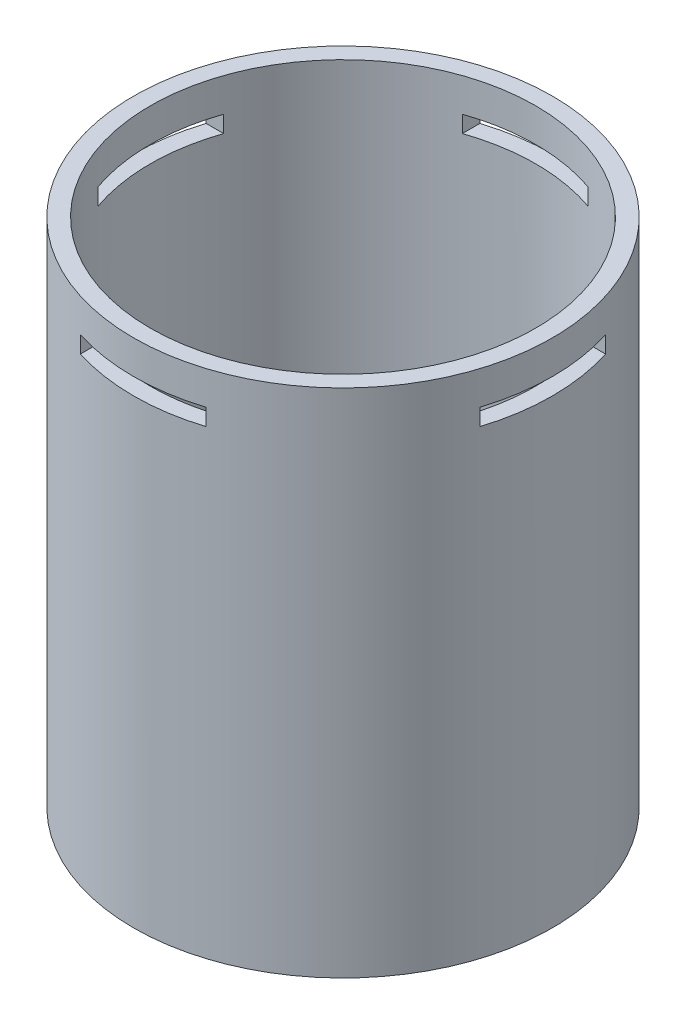
ISO-10303-21;
HEADER;
FILE_DESCRIPTION(('STEP AP214'),'2;1');
FILE_NAME('part.step','',(''),(''),'','','');
FILE_SCHEMA(('AUTOMOTIVE_DESIGN { 1 0 10303 214 1 1 1 1 }'));
ENDSEC;
DATA;
#1=APPLICATION_CONTEXT('core data for automotive mechanical design processes');
#2=APPLICATION_PROTOCOL_DEFINITION('international standard','automotive_design',2000,#1);
#3=PRODUCT_CONTEXT('',#1,'mechanical');
#4=PRODUCT('Part','Part','',(#3));
#5=PRODUCT_RELATED_PRODUCT_CATEGORY('part','',(#4));
#6=PRODUCT_DEFINITION_FORMATION('','',#4);
#7=PRODUCT_DEFINITION_CONTEXT('part definition',#1,'design');
#8=PRODUCT_DEFINITION('design','',#6,#7);
#9=PRODUCT_DEFINITION_SHAPE('','',#8);
#10=(LENGTH_UNIT() NAMED_UNIT(*) SI_UNIT(.MILLI.,.METRE.));
#11=(NAMED_UNIT(*) PLANE_ANGLE_UNIT() SI_UNIT($,.RADIAN.));
#12=(NAMED_UNIT(*) SI_UNIT($,.STERADIAN.) SOLID_ANGLE_UNIT());
#13=UNCERTAINTY_MEASURE_WITH_UNIT(LENGTH_MEASURE(1.E-05),#10,'distance_accuracy_value','');
#14=(GEOMETRIC_REPRESENTATION_CONTEXT(3) GLOBAL_UNCERTAINTY_ASSIGNED_CONTEXT((#13)) GLOBAL_UNIT_ASSIGNED_CONTEXT((#10,
#11,#12)) REPRESENTATION_CONTEXT('',''));
#15=CARTESIAN_POINT('',(0.,0.,0.));
#16=DIRECTION('',(0.,0.,1.));
#17=DIRECTION('',(1.,0.,0.));
#18=AXIS2_PLACEMENT_3D('',#15,#16,#17);
#19=CARTESIAN_POINT('',(0.,61.,0.));
#20=DIRECTION('',(0.,1.,0.));
#21=DIRECTION('',(0.,0.,1.));
#22=AXIS2_PLACEMENT_3D('',#19,#20,#21);
#23=PLANE('',#22);
#24=CARTESIAN_POINT('',(0.,61.,0.));
#25=DIRECTION('',(0.,1.,0.));
#26=DIRECTION('',(0.,0.,1.));
#27=AXIS2_PLACEMENT_3D('',#24,#25,#26);
#28=CIRCLE('',#27,25.);
#29=CARTESIAN_POINT('',(0.,61.,25.));
#30=VERTEX_POINT('',#29);
#31=EDGE_CURVE('E284',#30,#30,#28,.T.);
#32=ORIENTED_EDGE('',*,*,#31,.T.);
#33=EDGE_LOOP('',(#32));
#34=FACE_BOUND('',#33,.T.);
#35=CARTESIAN_POINT('',(0.,61.,0.));
#36=DIRECTION('',(0.,1.,0.));
#37=DIRECTION('',(0.,0.,1.));
#38=AXIS2_PLACEMENT_3D('',#35,#36,#37);
#39=CIRCLE('',#38,23.);
#40=CARTESIAN_POINT('',(0.,61.,23.));
#41=VERTEX_POINT('',#40);
#42=EDGE_CURVE('E278',#41,#41,#39,.T.);
#43=ORIENTED_EDGE('',*,*,#42,.F.);
#44=EDGE_LOOP('',(#43));
#45=FACE_BOUND('',#44,.T.);
#46=ADVANCED_FACE('F36',(#34,#45),#23,.T.);
#47=CARTESIAN_POINT('',(0.,0.,0.));
#48=DIRECTION('',(0.,1.,0.));
#49=DIRECTION('',(0.,0.,1.));
#50=AXIS2_PLACEMENT_3D('',#47,#48,#49);
#51=PLANE('',#50);
#52=CARTESIAN_POINT('',(0.,0.,0.));
#53=DIRECTION('',(0.,1.,0.));
#54=DIRECTION('',(0.,0.,1.));
#55=AXIS2_PLACEMENT_3D('',#52,#53,#54);
#56=CIRCLE('',#55,25.);
#57=CARTESIAN_POINT('',(0.,0.,25.));
#58=VERTEX_POINT('',#57);
#59=EDGE_CURVE('E281',#58,#58,#56,.T.);
#60=ORIENTED_EDGE('',*,*,#59,.F.);
#61=EDGE_LOOP('',(#60));
#62=FACE_BOUND('',#61,.T.);
#63=CARTESIAN_POINT('',(0.,0.,0.));
#64=DIRECTION('',(0.,1.,0.));
#65=DIRECTION('',(0.,0.,1.));
#66=AXIS2_PLACEMENT_3D('',#63,#64,#65);
#67=CIRCLE('',#66,23.);
#68=CARTESIAN_POINT('',(0.,0.,23.));
#69=VERTEX_POINT('',#68);
#70=EDGE_CURVE('E277',#69,#69,#67,.T.);
#71=ORIENTED_EDGE('',*,*,#70,.T.);
#72=EDGE_LOOP('',(#71));
#73=FACE_BOUND('',#72,.T.);
#74=ADVANCED_FACE('F325',(#62,#73),#51,.F.);
#75=CARTESIAN_POINT('',(0.,61.,0.));
#76=DIRECTION('',(0.,-1.,0.));
#77=DIRECTION('',(0.,0.,-1.));
#78=AXIS2_PLACEMENT_3D('',#75,#76,#77);
#79=CYLINDRICAL_SURFACE('',#78,25.);
#80=CARTESIAN_POINT('',(0.,55.,0.));
#81=DIRECTION('',(0.,-1.,0.));
#82=DIRECTION('',(0.,0.,-1.));
#83=AXIS2_PLACEMENT_3D('',#80,#81,#82);
#84=CIRCLE('',#83,25.);
#85=CARTESIAN_POINT('',(23.8484800354237,55.,-7.49999999999992));
#86=VERTEX_POINT('',#85);
#87=CARTESIAN_POINT('',(23.8484800354236,55.,7.50000000000008));
#88=VERTEX_POINT('',#87);
#89=EDGE_CURVE('E212',#86,#88,#84,.T.);
#90=ORIENTED_EDGE('',*,*,#89,.T.);
#91=DIRECTION('',(0.,-1.,0.));
#92=VECTOR('',#91,1.);
#93=CARTESIAN_POINT('',(23.8484800354236,61.,7.50000000000008));
#94=LINE('',#93,#92);
#95=CARTESIAN_POINT('',(23.8484800354236,57.,7.50000000000008));
#96=VERTEX_POINT('',#95);
#97=EDGE_CURVE('E223',#88,#96,#94,.F.);
#98=ORIENTED_EDGE('',*,*,#97,.T.);
#99=CARTESIAN_POINT('',(0.,57.,0.));
#100=DIRECTION('',(0.,1.,0.));
#101=DIRECTION('',(0.,0.,1.));
#102=AXIS2_PLACEMENT_3D('',#99,#100,#101);
#103=CIRCLE('',#102,25.);
#104=CARTESIAN_POINT('',(23.8484800354237,57.,-7.49999999999991));
#105=VERTEX_POINT('',#104);
#106=EDGE_CURVE('E245',#96,#105,#103,.T.);
#107=ORIENTED_EDGE('',*,*,#106,.T.);
#108=DIRECTION('',(0.,-1.,0.));
#109=VECTOR('',#108,1.);
#110=CARTESIAN_POINT('',(23.8484800354237,61.,-7.49999999999991));
#111=LINE('',#110,#109);
#112=EDGE_CURVE('E249',#105,#86,#111,.T.);
#113=ORIENTED_EDGE('',*,*,#112,.T.);
#114=EDGE_LOOP('',(#90,#98,#107,#113));
#115=FACE_BOUND('',#114,.T.);
#116=CARTESIAN_POINT('',(7.5,55.,23.8484800354236));
#117=VERTEX_POINT('',#116);
#118=CARTESIAN_POINT('',(-7.5,55.,23.8484800354236));
#119=VERTEX_POINT('',#118);
#120=EDGE_CURVE('E252',#117,#119,#84,.T.);
#121=ORIENTED_EDGE('',*,*,#120,.T.);
#122=DIRECTION('',(0.,-1.,0.));
#123=VECTOR('',#122,1.);
#124=CARTESIAN_POINT('',(-7.5,61.,23.8484800354236));
#125=LINE('',#124,#123);
#126=CARTESIAN_POINT('',(-7.5,57.,23.8484800354236));
#127=VERTEX_POINT('',#126);
#128=EDGE_CURVE('E238',#119,#127,#125,.F.);
#129=ORIENTED_EDGE('',*,*,#128,.T.);
#130=CARTESIAN_POINT('',(7.5,57.,23.8484800354236));
#131=VERTEX_POINT('',#130);
#132=EDGE_CURVE('E241',#127,#131,#103,.T.);
#133=ORIENTED_EDGE('',*,*,#132,.T.);
#134=DIRECTION('',(0.,-1.,0.));
#135=VECTOR('',#134,1.);
#136=CARTESIAN_POINT('',(7.5,61.,23.8484800354236));
#137=LINE('',#136,#135);
#138=EDGE_CURVE('E226',#131,#117,#137,.T.);
#139=ORIENTED_EDGE('',*,*,#138,.T.);
#140=EDGE_LOOP('',(#121,#129,#133,#139));
#141=FACE_BOUND('',#140,.T.);
#142=DIRECTION('',(0.,-1.,0.));
#143=VECTOR('',#142,1.);
#144=CARTESIAN_POINT('',(-23.8484800354237,61.,7.49999999999975));
#145=LINE('',#144,#143);
#146=CARTESIAN_POINT('',(-23.8484800354237,57.,7.49999999999975));
#147=VERTEX_POINT('',#146);
#148=CARTESIAN_POINT('',(-23.8484800354237,55.,7.49999999999975));
#149=VERTEX_POINT('',#148);
#150=EDGE_CURVE('E224',#147,#149,#145,.T.);
#151=ORIENTED_EDGE('',*,*,#150,.T.);
#152=CARTESIAN_POINT('',(-23.8484800354236,55.,-7.50000000000008));
#153=VERTEX_POINT('',#152);
#154=EDGE_CURVE('E168',#149,#153,#84,.T.);
#155=ORIENTED_EDGE('',*,*,#154,.T.);
#156=DIRECTION('',(0.,-1.,0.));
#157=VECTOR('',#156,1.);
#158=CARTESIAN_POINT('',(-23.8484800354236,61.,-7.50000000000008));
#159=LINE('',#158,#157);
#160=CARTESIAN_POINT('',(-23.8484800354236,57.,-7.50000000000008));
#161=VERTEX_POINT('',#160);
#162=EDGE_CURVE('E246',#153,#161,#159,.F.);
#163=ORIENTED_EDGE('',*,*,#162,.T.);
#164=EDGE_CURVE('E244',#161,#147,#103,.T.);
#165=ORIENTED_EDGE('',*,*,#164,.T.);
#166=EDGE_LOOP('',(#151,#155,#163,#165));
#167=FACE_BOUND('',#166,.T.);
#168=CARTESIAN_POINT('',(0.,55.,0.));
#169=DIRECTION('',(0.,-1.,0.));
#170=DIRECTION('',(0.,0.,-1.));
#171=AXIS2_PLACEMENT_3D('',#168,#169,#170);
#172=CIRCLE('',#171,25.);
#173=CARTESIAN_POINT('',(-7.5,55.,-23.8484800354236));
#174=VERTEX_POINT('',#173);
#175=CARTESIAN_POINT('',(7.5,55.,-23.8484800354236));
#176=VERTEX_POINT('',#175);
#177=EDGE_CURVE('E271',#174,#176,#172,.T.);
#178=ORIENTED_EDGE('',*,*,#177,.T.);
#179=DIRECTION('',(0.,-1.,0.));
#180=VECTOR('',#179,1.);
#181=CARTESIAN_POINT('',(7.5,61.,-23.8484800354236));
#182=LINE('',#181,#180);
#183=CARTESIAN_POINT('',(7.5,57.,-23.8484800354236));
#184=VERTEX_POINT('',#183);
#185=EDGE_CURVE('E274',#176,#184,#182,.F.);
#186=ORIENTED_EDGE('',*,*,#185,.T.);
#187=CARTESIAN_POINT('',(0.,57.,0.));
#188=DIRECTION('',(0.,1.,0.));
#189=DIRECTION('',(0.,0.,1.));
#190=AXIS2_PLACEMENT_3D('',#187,#188,#189);
#191=CIRCLE('',#190,25.);
#192=CARTESIAN_POINT('',(-7.5,57.,-23.8484800354236));
#193=VERTEX_POINT('',#192);
#194=EDGE_CURVE('E258',#184,#193,#191,.T.);
#195=ORIENTED_EDGE('',*,*,#194,.T.);
#196=DIRECTION('',(0.,-1.,0.));
#197=VECTOR('',#196,1.);
#198=CARTESIAN_POINT('',(-7.5,61.,-23.8484800354236));
#199=LINE('',#198,#197);
#200=EDGE_CURVE('E268',#193,#174,#199,.T.);
#201=ORIENTED_EDGE('',*,*,#200,.T.);
#202=EDGE_LOOP('',(#178,#186,#195,#201));
#203=FACE_BOUND('',#202,.T.);
#204=ORIENTED_EDGE('',*,*,#31,.F.);
#205=EDGE_LOOP('',(#204));
#206=FACE_BOUND('',#205,.T.);
#207=ORIENTED_EDGE('',*,*,#59,.T.);
#208=EDGE_LOOP('',(#207));
#209=FACE_BOUND('',#208,.T.);
#210=ADVANCED_FACE('F38',(#115,#141,#167,#203,#206,#209),#79,.T.);
#211=CARTESIAN_POINT('',(0.,61.,0.));
#212=DIRECTION('',(0.,-1.,0.));
#213=DIRECTION('',(0.,0.,-1.));
#214=AXIS2_PLACEMENT_3D('',#211,#212,#213);
#215=CYLINDRICAL_SURFACE('',#214,23.);
#216=DIRECTION('',(0.,-1.,0.));
#217=VECTOR('',#216,1.);
#218=CARTESIAN_POINT('',(21.7428149051589,61.,7.50000000000007));
#219=LINE('',#218,#217);
#220=CARTESIAN_POINT('',(21.7428149051589,55.,7.50000000000007));
#221=VERTEX_POINT('',#220);
#222=CARTESIAN_POINT('',(21.7428149051589,57.,7.50000000000007));
#223=VERTEX_POINT('',#222);
#224=EDGE_CURVE('E11',#221,#223,#219,.F.);
#225=ORIENTED_EDGE('',*,*,#224,.F.);
#226=CARTESIAN_POINT('',(0.,55.,0.));
#227=DIRECTION('',(0.,-1.,0.));
#228=DIRECTION('',(0.,0.,-1.));
#229=AXIS2_PLACEMENT_3D('',#226,#227,#228);
#230=CIRCLE('',#229,23.);
#231=CARTESIAN_POINT('',(21.7428149051589,55.,-7.49999999999992));
#232=VERTEX_POINT('',#231);
#233=EDGE_CURVE('E44',#232,#221,#230,.T.);
#234=ORIENTED_EDGE('',*,*,#233,.F.);
#235=DIRECTION('',(0.,-1.,0.));
#236=VECTOR('',#235,1.);
#237=CARTESIAN_POINT('',(21.7428149051589,61.,-7.49999999999992));
#238=LINE('',#237,#236);
#239=CARTESIAN_POINT('',(21.7428149051589,57.,-7.49999999999992));
#240=VERTEX_POINT('',#239);
#241=EDGE_CURVE('E182',#240,#232,#238,.T.);
#242=ORIENTED_EDGE('',*,*,#241,.F.);
#243=CARTESIAN_POINT('',(0.,57.,0.));
#244=DIRECTION('',(0.,1.,0.));
#245=DIRECTION('',(0.,0.,1.));
#246=AXIS2_PLACEMENT_3D('',#243,#244,#245);
#247=CIRCLE('',#246,23.);
#248=EDGE_CURVE('E188',#223,#240,#247,.T.);
#249=ORIENTED_EDGE('',*,*,#248,.F.);
#250=EDGE_LOOP('',(#225,#234,#242,#249));
#251=FACE_BOUND('',#250,.T.);
#252=DIRECTION('',(0.,-1.,0.));
#253=VECTOR('',#252,1.);
#254=CARTESIAN_POINT('',(-7.5,61.,21.7428149051589));
#255=LINE('',#254,#253);
#256=CARTESIAN_POINT('',(-7.5,55.,21.7428149051589));
#257=VERTEX_POINT('',#256);
#258=CARTESIAN_POINT('',(-7.5,57.,21.7428149051589));
#259=VERTEX_POINT('',#258);
#260=EDGE_CURVE('E183',#257,#259,#255,.F.);
#261=ORIENTED_EDGE('',*,*,#260,.F.);
#262=CARTESIAN_POINT('',(7.5,55.,21.7428149051589));
#263=VERTEX_POINT('',#262);
#264=EDGE_CURVE('E178',#263,#257,#230,.T.);
#265=ORIENTED_EDGE('',*,*,#264,.F.);
#266=DIRECTION('',(0.,-1.,0.));
#267=VECTOR('',#266,1.);
#268=CARTESIAN_POINT('',(7.5,61.,21.7428149051589));
#269=LINE('',#268,#267);
#270=CARTESIAN_POINT('',(7.5,57.,21.7428149051589));
#271=VERTEX_POINT('',#270);
#272=EDGE_CURVE('E176',#271,#263,#269,.T.);
#273=ORIENTED_EDGE('',*,*,#272,.F.);
#274=EDGE_CURVE('E179',#259,#271,#247,.T.);
#275=ORIENTED_EDGE('',*,*,#274,.F.);
#276=EDGE_LOOP('',(#261,#265,#273,#275));
#277=FACE_BOUND('',#276,.T.);
#278=CARTESIAN_POINT('',(-21.742814905159,55.,7.49999999999977));
#279=VERTEX_POINT('',#278);
#280=CARTESIAN_POINT('',(-21.7428149051589,55.,-7.50000000000008));
#281=VERTEX_POINT('',#280);
#282=EDGE_CURVE('E165',#279,#281,#230,.T.);
#283=ORIENTED_EDGE('',*,*,#282,.F.);
#284=DIRECTION('',(0.,-1.,0.));
#285=VECTOR('',#284,1.);
#286=CARTESIAN_POINT('',(-21.742814905159,61.,7.49999999999977));
#287=LINE('',#286,#285);
#288=CARTESIAN_POINT('',(-21.742814905159,57.,7.49999999999977));
#289=VERTEX_POINT('',#288);
#290=EDGE_CURVE('E148',#289,#279,#287,.T.);
#291=ORIENTED_EDGE('',*,*,#290,.F.);
#292=CARTESIAN_POINT('',(-21.7428149051589,57.,-7.50000000000007));
#293=VERTEX_POINT('',#292);
#294=EDGE_CURVE('E159',#293,#289,#247,.T.);
#295=ORIENTED_EDGE('',*,*,#294,.F.);
#296=DIRECTION('',(0.,-1.,0.));
#297=VECTOR('',#296,1.);
#298=CARTESIAN_POINT('',(-21.7428149051589,61.,-7.50000000000007));
#299=LINE('',#298,#297);
#300=EDGE_CURVE('E175',#281,#293,#299,.F.);
#301=ORIENTED_EDGE('',*,*,#300,.F.);
#302=EDGE_LOOP('',(#283,#291,#295,#301));
#303=FACE_BOUND('',#302,.T.);
#304=DIRECTION('',(0.,-1.,0.));
#305=VECTOR('',#304,1.);
#306=CARTESIAN_POINT('',(7.5,61.,-21.7428149051589));
#307=LINE('',#306,#305);
#308=CARTESIAN_POINT('',(7.5,55.,-21.7428149051589));
#309=VERTEX_POINT('',#308);
#310=CARTESIAN_POINT('',(7.5,57.,-21.7428149051589));
#311=VERTEX_POINT('',#310);
#312=EDGE_CURVE('E160',#309,#311,#307,.F.);
#313=ORIENTED_EDGE('',*,*,#312,.F.);
#314=CARTESIAN_POINT('',(0.,55.,0.));
#315=DIRECTION('',(0.,-1.,0.));
#316=DIRECTION('',(0.,0.,-1.));
#317=AXIS2_PLACEMENT_3D('',#314,#315,#316);
#318=CIRCLE('',#317,23.);
#319=CARTESIAN_POINT('',(-7.5,55.,-21.7428149051589));
#320=VERTEX_POINT('',#319);
#321=EDGE_CURVE('E293',#320,#309,#318,.T.);
#322=ORIENTED_EDGE('',*,*,#321,.F.);
#323=DIRECTION('',(0.,-1.,0.));
#324=VECTOR('',#323,1.);
#325=CARTESIAN_POINT('',(-7.5,61.,-21.7428149051589));
#326=LINE('',#325,#324);
#327=CARTESIAN_POINT('',(-7.5,57.,-21.7428149051589));
#328=VERTEX_POINT('',#327);
#329=EDGE_CURVE('E291',#328,#320,#326,.T.);
#330=ORIENTED_EDGE('',*,*,#329,.F.);
#331=CARTESIAN_POINT('',(0.,57.,0.));
#332=DIRECTION('',(0.,1.,0.));
#333=DIRECTION('',(0.,0.,1.));
#334=AXIS2_PLACEMENT_3D('',#331,#332,#333);
#335=CIRCLE('',#334,23.);
#336=EDGE_CURVE('E287',#311,#328,#335,.T.);
#337=ORIENTED_EDGE('',*,*,#336,.F.);
#338=EDGE_LOOP('',(#313,#322,#330,#337));
#339=FACE_BOUND('',#338,.T.);
#340=ORIENTED_EDGE('',*,*,#42,.T.);
#341=EDGE_LOOP('',(#340));
#342=FACE_BOUND('',#341,.T.);
#343=ORIENTED_EDGE('',*,*,#70,.F.);
#344=EDGE_LOOP('',(#343));
#345=FACE_BOUND('',#344,.T.);
#346=ADVANCED_FACE('F173',(#251,#277,#303,#339,#342,#345),#215,.F.);
#347=CARTESIAN_POINT('',(7.5,57.,-26.));
#348=DIRECTION('',(1.,0.,0.));
#349=DIRECTION('',(0.,0.,-1.));
#350=AXIS2_PLACEMENT_3D('',#347,#348,#349);
#351=PLANE('',#350);
#352=DIRECTION('',(0.,0.,1.));
#353=VECTOR('',#352,1.);
#354=CARTESIAN_POINT('',(7.5,55.,-26.));
#355=LINE('',#354,#353);
#356=EDGE_CURVE('E255',#176,#309,#355,.T.);
#357=ORIENTED_EDGE('',*,*,#356,.T.);
#358=ORIENTED_EDGE('',*,*,#312,.T.);
#359=DIRECTION('',(0.,0.,1.));
#360=VECTOR('',#359,1.);
#361=CARTESIAN_POINT('',(7.5,57.,-26.));
#362=LINE('',#361,#360);
#363=EDGE_CURVE('E254',#184,#311,#362,.T.);
#364=ORIENTED_EDGE('',*,*,#363,.F.);
#365=ORIENTED_EDGE('',*,*,#185,.F.);
#366=EDGE_LOOP('',(#357,#358,#364,#365));
#367=FACE_BOUND('',#366,.T.);
#368=ADVANCED_FACE('F300',(#367),#351,.F.);
#369=CARTESIAN_POINT('',(7.5,55.,-26.));
#370=DIRECTION('',(0.,-1.,0.));
#371=DIRECTION('',(0.,0.,-1.));
#372=AXIS2_PLACEMENT_3D('',#369,#370,#371);
#373=PLANE('',#372);
#374=DIRECTION('',(0.,0.,1.));
#375=VECTOR('',#374,1.);
#376=CARTESIAN_POINT('',(-7.5,55.,-26.));
#377=LINE('',#376,#375);
#378=EDGE_CURVE('E259',#174,#320,#377,.T.);
#379=ORIENTED_EDGE('',*,*,#378,.T.);
#380=ORIENTED_EDGE('',*,*,#321,.T.);
#381=ORIENTED_EDGE('',*,*,#356,.F.);
#382=ORIENTED_EDGE('',*,*,#177,.F.);
#383=EDGE_LOOP('',(#379,#380,#381,#382));
#384=FACE_BOUND('',#383,.T.);
#385=ADVANCED_FACE('F314',(#384),#373,.F.);
#386=CARTESIAN_POINT('',(-7.5,57.,-26.));
#387=DIRECTION('',(-1.,0.,0.));
#388=DIRECTION('',(0.,0.,1.));
#389=AXIS2_PLACEMENT_3D('',#386,#387,#388);
#390=PLANE('',#389);
#391=DIRECTION('',(0.,0.,1.));
#392=VECTOR('',#391,1.);
#393=CARTESIAN_POINT('',(-7.5,57.,-26.));
#394=LINE('',#393,#392);
#395=EDGE_CURVE('E262',#193,#328,#394,.T.);
#396=ORIENTED_EDGE('',*,*,#395,.T.);
#397=ORIENTED_EDGE('',*,*,#329,.T.);
#398=ORIENTED_EDGE('',*,*,#378,.F.);
#399=ORIENTED_EDGE('',*,*,#200,.F.);
#400=EDGE_LOOP('',(#396,#397,#398,#399));
#401=FACE_BOUND('',#400,.T.);
#402=ADVANCED_FACE('F309',(#401),#390,.F.);
#403=CARTESIAN_POINT('',(7.5,57.,-26.));
#404=DIRECTION('',(0.,1.,0.));
#405=DIRECTION('',(0.,0.,1.));
#406=AXIS2_PLACEMENT_3D('',#403,#404,#405);
#407=PLANE('',#406);
#408=ORIENTED_EDGE('',*,*,#363,.T.);
#409=ORIENTED_EDGE('',*,*,#336,.T.);
#410=ORIENTED_EDGE('',*,*,#395,.F.);
#411=ORIENTED_EDGE('',*,*,#194,.F.);
#412=EDGE_LOOP('',(#408,#409,#410,#411));
#413=FACE_BOUND('',#412,.T.);
#414=ADVANCED_FACE('F306',(#413),#407,.F.);
#415=CARTESIAN_POINT('',(-26.0000000000001,57.,7.49999999999973));
#416=DIRECTION('',(0.,0.,1.));
#417=DIRECTION('',(1.,0.,0.));
#418=AXIS2_PLACEMENT_3D('',#415,#416,#417);
#419=PLANE('',#418);
#420=DIRECTION('',(1.,0.,0.));
#421=VECTOR('',#420,1.);
#422=CARTESIAN_POINT('',(-26.0000000000001,57.,7.49999999999973));
#423=LINE('',#422,#421);
#424=EDGE_CURVE('E154',#147,#289,#423,.T.);
#425=ORIENTED_EDGE('',*,*,#424,.T.);
#426=ORIENTED_EDGE('',*,*,#290,.T.);
#427=DIRECTION('',(1.,0.,0.));
#428=VECTOR('',#427,1.);
#429=CARTESIAN_POINT('',(-26.0000000000001,55.,7.49999999999973));
#430=LINE('',#429,#428);
#431=EDGE_CURVE('E151',#149,#279,#430,.T.);
#432=ORIENTED_EDGE('',*,*,#431,.F.);
#433=ORIENTED_EDGE('',*,*,#150,.F.);
#434=EDGE_LOOP('',(#425,#426,#432,#433));
#435=FACE_BOUND('',#434,.T.);
#436=ADVANCED_FACE('F150',(#435),#419,.F.);
#437=CARTESIAN_POINT('',(26.,57.,7.50000000000009));
#438=DIRECTION('',(0.,1.,0.));
#439=DIRECTION('',(0.,0.,1.));
#440=AXIS2_PLACEMENT_3D('',#437,#438,#439);
#441=PLANE('',#440);
#442=DIRECTION('',(-1.,0.,0.));
#443=VECTOR('',#442,1.);
#444=CARTESIAN_POINT('',(26.,57.,-7.49999999999991));
#445=LINE('',#444,#443);
#446=EDGE_CURVE('E231',#293,#161,#445,.T.);
#447=ORIENTED_EDGE('',*,*,#446,.F.);
#448=ORIENTED_EDGE('',*,*,#294,.T.);
#449=ORIENTED_EDGE('',*,*,#424,.F.);
#450=ORIENTED_EDGE('',*,*,#164,.F.);
#451=EDGE_LOOP('',(#447,#448,#449,#450));
#452=FACE_BOUND('',#451,.T.);
#453=ADVANCED_FACE('F340',(#452),#441,.F.);
#454=CARTESIAN_POINT('',(26.,57.,-7.49999999999991));
#455=DIRECTION('',(0.,0.,-1.));
#456=DIRECTION('',(-1.,0.,0.));
#457=AXIS2_PLACEMENT_3D('',#454,#455,#456);
#458=PLANE('',#457);
#459=DIRECTION('',(-1.,0.,0.));
#460=VECTOR('',#459,1.);
#461=CARTESIAN_POINT('',(26.,55.,-7.49999999999991));
#462=LINE('',#461,#460);
#463=EDGE_CURVE('E214',#281,#153,#462,.T.);
#464=ORIENTED_EDGE('',*,*,#463,.F.);
#465=ORIENTED_EDGE('',*,*,#300,.T.);
#466=ORIENTED_EDGE('',*,*,#446,.T.);
#467=ORIENTED_EDGE('',*,*,#162,.F.);
#468=EDGE_LOOP('',(#464,#465,#466,#467));
#469=FACE_BOUND('',#468,.T.);
#470=ADVANCED_FACE('F345',(#469),#458,.F.);
#471=CARTESIAN_POINT('',(26.,55.,7.50000000000009));
#472=DIRECTION('',(0.,-1.,0.));
#473=DIRECTION('',(0.,0.,-1.));
#474=AXIS2_PLACEMENT_3D('',#471,#472,#473);
#475=PLANE('',#474);
#476=ORIENTED_EDGE('',*,*,#431,.T.);
#477=ORIENTED_EDGE('',*,*,#282,.T.);
#478=ORIENTED_EDGE('',*,*,#463,.T.);
#479=ORIENTED_EDGE('',*,*,#154,.F.);
#480=EDGE_LOOP('',(#476,#477,#478,#479));
#481=FACE_BOUND('',#480,.T.);
#482=ADVANCED_FACE('F163',(#481),#475,.F.);
#483=CARTESIAN_POINT('',(7.5,57.,26.));
#484=DIRECTION('',(1.,0.,0.));
#485=DIRECTION('',(0.,0.,-1.));
#486=AXIS2_PLACEMENT_3D('',#483,#484,#485);
#487=PLANE('',#486);
#488=DIRECTION('',(0.,0.,-1.));
#489=VECTOR('',#488,1.);
#490=CARTESIAN_POINT('',(7.5,57.,26.));
#491=LINE('',#490,#489);
#492=EDGE_CURVE('E383',#131,#271,#491,.T.);
#493=ORIENTED_EDGE('',*,*,#492,.T.);
#494=ORIENTED_EDGE('',*,*,#272,.T.);
#495=DIRECTION('',(0.,0.,-1.));
#496=VECTOR('',#495,1.);
#497=CARTESIAN_POINT('',(7.5,55.,26.));
#498=LINE('',#497,#496);
#499=EDGE_CURVE('E59',#117,#263,#498,.T.);
#500=ORIENTED_EDGE('',*,*,#499,.F.);
#501=ORIENTED_EDGE('',*,*,#138,.F.);
#502=EDGE_LOOP('',(#493,#494,#500,#501));
#503=FACE_BOUND('',#502,.T.);
#504=ADVANCED_FACE('F351',(#503),#487,.F.);
#505=CARTESIAN_POINT('',(-7.5,57.,26.));
#506=DIRECTION('',(-1.,0.,0.));
#507=DIRECTION('',(0.,0.,1.));
#508=AXIS2_PLACEMENT_3D('',#505,#506,#507);
#509=PLANE('',#508);
#510=DIRECTION('',(0.,0.,-1.));
#511=VECTOR('',#510,1.);
#512=CARTESIAN_POINT('',(-7.5,55.,26.));
#513=LINE('',#512,#511);
#514=EDGE_CURVE('E234',#119,#257,#513,.T.);
#515=ORIENTED_EDGE('',*,*,#514,.T.);
#516=ORIENTED_EDGE('',*,*,#260,.T.);
#517=DIRECTION('',(0.,0.,-1.));
#518=VECTOR('',#517,1.);
#519=CARTESIAN_POINT('',(-7.5,57.,26.));
#520=LINE('',#519,#518);
#521=EDGE_CURVE('E170',#127,#259,#520,.T.);
#522=ORIENTED_EDGE('',*,*,#521,.F.);
#523=ORIENTED_EDGE('',*,*,#128,.F.);
#524=EDGE_LOOP('',(#515,#516,#522,#523));
#525=FACE_BOUND('',#524,.T.);
#526=ADVANCED_FACE('F354',(#525),#509,.F.);
#527=ORIENTED_EDGE('',*,*,#521,.T.);
#528=ORIENTED_EDGE('',*,*,#274,.T.);
#529=ORIENTED_EDGE('',*,*,#492,.F.);
#530=ORIENTED_EDGE('',*,*,#132,.F.);
#531=EDGE_LOOP('',(#527,#528,#529,#530));
#532=FACE_BOUND('',#531,.T.);
#533=ADVANCED_FACE('F348',(#532),#441,.F.);
#534=ORIENTED_EDGE('',*,*,#499,.T.);
#535=ORIENTED_EDGE('',*,*,#264,.T.);
#536=ORIENTED_EDGE('',*,*,#514,.F.);
#537=ORIENTED_EDGE('',*,*,#120,.F.);
#538=EDGE_LOOP('',(#534,#535,#536,#537));
#539=FACE_BOUND('',#538,.T.);
#540=ADVANCED_FACE('F360',(#539),#475,.F.);
#541=CARTESIAN_POINT('',(26.,57.,7.50000000000009));
#542=DIRECTION('',(0.,0.,1.));
#543=DIRECTION('',(1.,0.,0.));
#544=AXIS2_PLACEMENT_3D('',#541,#542,#543);
#545=PLANE('',#544);
#546=DIRECTION('',(-1.,0.,0.));
#547=VECTOR('',#546,1.);
#548=CARTESIAN_POINT('',(26.,55.,7.50000000000009));
#549=LINE('',#548,#547);
#550=EDGE_CURVE('E213',#88,#221,#549,.T.);
#551=ORIENTED_EDGE('',*,*,#550,.T.);
#552=ORIENTED_EDGE('',*,*,#224,.T.);
#553=DIRECTION('',(-1.,0.,0.));
#554=VECTOR('',#553,1.);
#555=CARTESIAN_POINT('',(26.,57.,7.50000000000009));
#556=LINE('',#555,#554);
#557=EDGE_CURVE('E221',#96,#223,#556,.T.);
#558=ORIENTED_EDGE('',*,*,#557,.F.);
#559=ORIENTED_EDGE('',*,*,#97,.F.);
#560=EDGE_LOOP('',(#551,#552,#558,#559));
#561=FACE_BOUND('',#560,.T.);
#562=ADVANCED_FACE('F220',(#561),#545,.F.);
#563=EDGE_CURVE('E203',#86,#232,#462,.T.);
#564=ORIENTED_EDGE('',*,*,#563,.T.);
#565=ORIENTED_EDGE('',*,*,#233,.T.);
#566=ORIENTED_EDGE('',*,*,#550,.F.);
#567=ORIENTED_EDGE('',*,*,#89,.F.);
#568=EDGE_LOOP('',(#564,#565,#566,#567));
#569=FACE_BOUND('',#568,.T.);
#570=ADVANCED_FACE('F208',(#569),#475,.F.);
#571=EDGE_CURVE('E51',#105,#240,#445,.T.);
#572=ORIENTED_EDGE('',*,*,#571,.T.);
#573=ORIENTED_EDGE('',*,*,#241,.T.);
#574=ORIENTED_EDGE('',*,*,#563,.F.);
#575=ORIENTED_EDGE('',*,*,#112,.F.);
#576=EDGE_LOOP('',(#572,#573,#574,#575));
#577=FACE_BOUND('',#576,.T.);
#578=ADVANCED_FACE('F202',(#577),#458,.F.);
#579=ORIENTED_EDGE('',*,*,#557,.T.);
#580=ORIENTED_EDGE('',*,*,#248,.T.);
#581=ORIENTED_EDGE('',*,*,#571,.F.);
#582=ORIENTED_EDGE('',*,*,#106,.F.);
#583=EDGE_LOOP('',(#579,#580,#581,#582));
#584=FACE_BOUND('',#583,.T.);
#585=ADVANCED_FACE('F349',(#584),#441,.F.);
#586=CLOSED_SHELL('',(#46,#74,#210,#346,#368,#385,#402,#414,#436,#453,#470,#482,#504,#526,#533,
#540,#562,#570,#578,#585));
#587=MANIFOLD_SOLID_BREP('B2',#586);
#588=ADVANCED_BREP_SHAPE_REPRESENTATION('',(#18,#587),#14);
#589=SHAPE_DEFINITION_REPRESENTATION(#9,#588);
ENDSEC;
END-ISO-10303-21;
